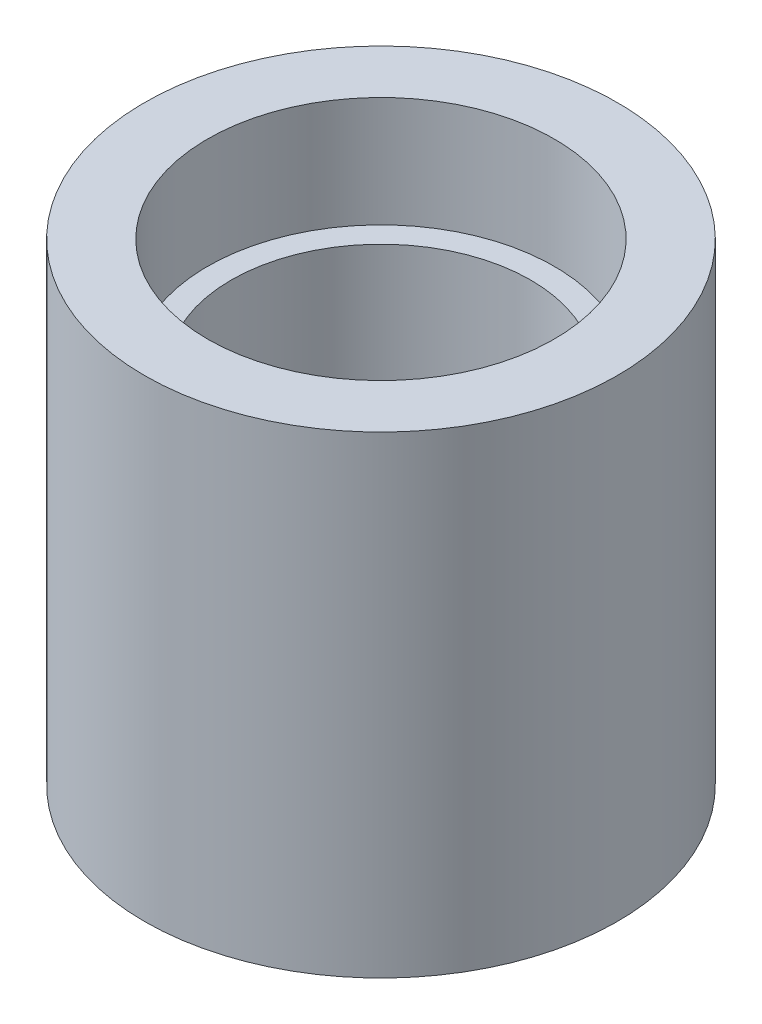
ISO-10303-21;
HEADER;
FILE_DESCRIPTION(('STEP AP214'),'2;1');
FILE_NAME('part.step','',(''),(''),'','','');
FILE_SCHEMA(('AUTOMOTIVE_DESIGN { 1 0 10303 214 1 1 1 1 }'));
ENDSEC;
DATA;
#1=APPLICATION_CONTEXT('core data for automotive mechanical design processes');
#2=APPLICATION_PROTOCOL_DEFINITION('international standard','automotive_design',2000,#1);
#3=PRODUCT_CONTEXT('',#1,'mechanical');
#4=PRODUCT('Part','Part','',(#3));
#5=PRODUCT_RELATED_PRODUCT_CATEGORY('part','',(#4));
#6=PRODUCT_DEFINITION_FORMATION('','',#4);
#7=PRODUCT_DEFINITION_CONTEXT('part definition',#1,'design');
#8=PRODUCT_DEFINITION('design','',#6,#7);
#9=PRODUCT_DEFINITION_SHAPE('','',#8);
#10=(LENGTH_UNIT() NAMED_UNIT(*) SI_UNIT(.MILLI.,.METRE.));
#11=(NAMED_UNIT(*) PLANE_ANGLE_UNIT() SI_UNIT($,.RADIAN.));
#12=(NAMED_UNIT(*) SI_UNIT($,.STERADIAN.) SOLID_ANGLE_UNIT());
#13=UNCERTAINTY_MEASURE_WITH_UNIT(LENGTH_MEASURE(1.E-05),#10,'distance_accuracy_value','');
#14=(GEOMETRIC_REPRESENTATION_CONTEXT(3) GLOBAL_UNCERTAINTY_ASSIGNED_CONTEXT((#13)) GLOBAL_UNIT_ASSIGNED_CONTEXT((#10,
#11,#12)) REPRESENTATION_CONTEXT('',''));
#15=CARTESIAN_POINT('',(0.,0.,0.));
#16=DIRECTION('',(0.,0.,1.));
#17=DIRECTION('',(1.,0.,0.));
#18=AXIS2_PLACEMENT_3D('',#15,#16,#17);
#19=CARTESIAN_POINT('',(0.,30.,0.));
#20=DIRECTION('',(0.,-1.,0.));
#21=DIRECTION('',(0.,0.,-1.));
#22=AXIS2_PLACEMENT_3D('',#19,#20,#21);
#23=CYLINDRICAL_SURFACE('',#22,15.);
#24=CARTESIAN_POINT('',(0.,30.,0.));
#25=DIRECTION('',(0.,1.,0.));
#26=DIRECTION('',(0.,0.,1.));
#27=AXIS2_PLACEMENT_3D('',#24,#25,#26);
#28=CIRCLE('',#27,15.);
#29=CARTESIAN_POINT('',(0.,30.,15.));
#30=VERTEX_POINT('',#29);
#31=EDGE_CURVE('E10',#30,#30,#28,.T.);
#32=ORIENTED_EDGE('',*,*,#31,.F.);
#33=EDGE_LOOP('',(#32));
#34=FACE_BOUND('',#33,.T.);
#35=CARTESIAN_POINT('',(0.,0.,0.));
#36=DIRECTION('',(0.,1.,0.));
#37=DIRECTION('',(0.,0.,1.));
#38=AXIS2_PLACEMENT_3D('',#35,#36,#37);
#39=CIRCLE('',#38,15.);
#40=CARTESIAN_POINT('',(0.,0.,15.));
#41=VERTEX_POINT('',#40);
#42=EDGE_CURVE('E35',#41,#41,#39,.T.);
#43=ORIENTED_EDGE('',*,*,#42,.T.);
#44=EDGE_LOOP('',(#43));
#45=FACE_BOUND('',#44,.T.);
#46=ADVANCED_FACE('F32',(#34,#45),#23,.T.);
#47=CARTESIAN_POINT('',(0.,30.,0.));
#48=DIRECTION('',(0.,1.,0.));
#49=DIRECTION('',(0.,0.,1.));
#50=AXIS2_PLACEMENT_3D('',#47,#48,#49);
#51=PLANE('',#50);
#52=CARTESIAN_POINT('',(0.,30.,0.));
#53=DIRECTION('',(0.,1.,0.));
#54=DIRECTION('',(0.,0.,1.));
#55=AXIS2_PLACEMENT_3D('',#52,#53,#54);
#56=CIRCLE('',#55,11.);
#57=CARTESIAN_POINT('',(0.,30.,11.));
#58=VERTEX_POINT('',#57);
#59=EDGE_CURVE('E44',#58,#58,#56,.T.);
#60=ORIENTED_EDGE('',*,*,#59,.F.);
#61=EDGE_LOOP('',(#60));
#62=FACE_BOUND('',#61,.T.);
#63=ORIENTED_EDGE('',*,*,#31,.T.);
#64=EDGE_LOOP('',(#63));
#65=FACE_BOUND('',#64,.T.);
#66=ADVANCED_FACE('F78',(#62,#65),#51,.T.);
#67=CARTESIAN_POINT('',(0.,0.,0.));
#68=DIRECTION('',(0.,1.,0.));
#69=DIRECTION('',(0.,0.,1.));
#70=AXIS2_PLACEMENT_3D('',#67,#68,#69);
#71=PLANE('',#70);
#72=CARTESIAN_POINT('',(0.,0.,0.));
#73=DIRECTION('',(0.,-1.,0.));
#74=DIRECTION('',(0.,0.,-1.));
#75=AXIS2_PLACEMENT_3D('',#72,#73,#74);
#76=CIRCLE('',#75,11.);
#77=CARTESIAN_POINT('',(0.,0.,-11.));
#78=VERTEX_POINT('',#77);
#79=EDGE_CURVE('E50',#78,#78,#76,.T.);
#80=ORIENTED_EDGE('',*,*,#79,.F.);
#81=EDGE_LOOP('',(#80));
#82=FACE_BOUND('',#81,.T.);
#83=ORIENTED_EDGE('',*,*,#42,.F.);
#84=EDGE_LOOP('',(#83));
#85=FACE_BOUND('',#84,.T.);
#86=ADVANCED_FACE('F74',(#82,#85),#71,.F.);
#87=CARTESIAN_POINT('',(0.,23.,0.));
#88=DIRECTION('',(0.,1.,0.));
#89=DIRECTION('',(0.,0.,1.));
#90=AXIS2_PLACEMENT_3D('',#87,#88,#89);
#91=CYLINDRICAL_SURFACE('',#90,11.);
#92=CARTESIAN_POINT('',(0.,23.,0.));
#93=DIRECTION('',(0.,1.,0.));
#94=DIRECTION('',(0.,0.,1.));
#95=AXIS2_PLACEMENT_3D('',#92,#93,#94);
#96=CIRCLE('',#95,11.);
#97=CARTESIAN_POINT('',(0.,23.,11.));
#98=VERTEX_POINT('',#97);
#99=EDGE_CURVE('E42',#98,#98,#96,.T.);
#100=ORIENTED_EDGE('',*,*,#99,.F.);
#101=EDGE_LOOP('',(#100));
#102=FACE_BOUND('',#101,.T.);
#103=ORIENTED_EDGE('',*,*,#59,.T.);
#104=EDGE_LOOP('',(#103));
#105=FACE_BOUND('',#104,.T.);
#106=ADVANCED_FACE('F68',(#102,#105),#91,.F.);
#107=CARTESIAN_POINT('',(0.,23.,0.));
#108=DIRECTION('',(0.,1.,0.));
#109=DIRECTION('',(0.,0.,1.));
#110=AXIS2_PLACEMENT_3D('',#107,#108,#109);
#111=PLANE('',#110);
#112=CARTESIAN_POINT('',(0.,23.,0.));
#113=DIRECTION('',(0.,1.,0.));
#114=DIRECTION('',(0.,0.,1.));
#115=AXIS2_PLACEMENT_3D('',#112,#113,#114);
#116=CIRCLE('',#115,9.5);
#117=CARTESIAN_POINT('',(0.,23.,9.5));
#118=VERTEX_POINT('',#117);
#119=EDGE_CURVE('E53',#118,#118,#116,.T.);
#120=ORIENTED_EDGE('',*,*,#119,.F.);
#121=EDGE_LOOP('',(#120));
#122=FACE_BOUND('',#121,.T.);
#123=ORIENTED_EDGE('',*,*,#99,.T.);
#124=EDGE_LOOP('',(#123));
#125=FACE_BOUND('',#124,.T.);
#126=ADVANCED_FACE('F64',(#122,#125),#111,.T.);
#127=CARTESIAN_POINT('',(0.,7.,0.));
#128=DIRECTION('',(0.,-1.,0.));
#129=DIRECTION('',(0.,0.,-1.));
#130=AXIS2_PLACEMENT_3D('',#127,#128,#129);
#131=CYLINDRICAL_SURFACE('',#130,11.);
#132=CARTESIAN_POINT('',(0.,7.,0.));
#133=DIRECTION('',(0.,-1.,0.));
#134=DIRECTION('',(0.,0.,-1.));
#135=AXIS2_PLACEMENT_3D('',#132,#133,#134);
#136=CIRCLE('',#135,11.);
#137=CARTESIAN_POINT('',(0.,7.,-11.));
#138=VERTEX_POINT('',#137);
#139=EDGE_CURVE('E47',#138,#138,#136,.T.);
#140=ORIENTED_EDGE('',*,*,#139,.F.);
#141=EDGE_LOOP('',(#140));
#142=FACE_BOUND('',#141,.T.);
#143=ORIENTED_EDGE('',*,*,#79,.T.);
#144=EDGE_LOOP('',(#143));
#145=FACE_BOUND('',#144,.T.);
#146=ADVANCED_FACE('F67',(#142,#145),#131,.F.);
#147=CARTESIAN_POINT('',(0.,7.,0.));
#148=DIRECTION('',(0.,-1.,0.));
#149=DIRECTION('',(0.,0.,-1.));
#150=AXIS2_PLACEMENT_3D('',#147,#148,#149);
#151=PLANE('',#150);
#152=CARTESIAN_POINT('',(0.,7.,0.));
#153=DIRECTION('',(0.,-1.,0.));
#154=DIRECTION('',(0.,0.,-1.));
#155=AXIS2_PLACEMENT_3D('',#152,#153,#154);
#156=CIRCLE('',#155,9.5);
#157=CARTESIAN_POINT('',(0.,7.,-9.5));
#158=VERTEX_POINT('',#157);
#159=EDGE_CURVE('E56',#158,#158,#156,.F.);
#160=ORIENTED_EDGE('',*,*,#159,.T.);
#161=EDGE_LOOP('',(#160));
#162=FACE_BOUND('',#161,.T.);
#163=ORIENTED_EDGE('',*,*,#139,.T.);
#164=EDGE_LOOP('',(#163));
#165=FACE_BOUND('',#164,.T.);
#166=ADVANCED_FACE('F90',(#162,#165),#151,.T.);
#167=CARTESIAN_POINT('',(0.,-0.001000000000001,0.));
#168=DIRECTION('',(0.,1.,0.));
#169=DIRECTION('',(0.,0.,1.));
#170=AXIS2_PLACEMENT_3D('',#167,#168,#169);
#171=CYLINDRICAL_SURFACE('',#170,9.5);
#172=ORIENTED_EDGE('',*,*,#159,.F.);
#173=EDGE_LOOP('',(#172));
#174=FACE_BOUND('',#173,.T.);
#175=ORIENTED_EDGE('',*,*,#119,.T.);
#176=EDGE_LOOP('',(#175));
#177=FACE_BOUND('',#176,.T.);
#178=ADVANCED_FACE('F62',(#174,#177),#171,.F.);
#179=CLOSED_SHELL('',(#46,#66,#86,#106,#126,#146,#166,#178));
#180=MANIFOLD_SOLID_BREP('B2',#179);
#181=ADVANCED_BREP_SHAPE_REPRESENTATION('',(#18,#180),#14);
#182=SHAPE_DEFINITION_REPRESENTATION(#9,#181);
ENDSEC;
END-ISO-10303-21;
